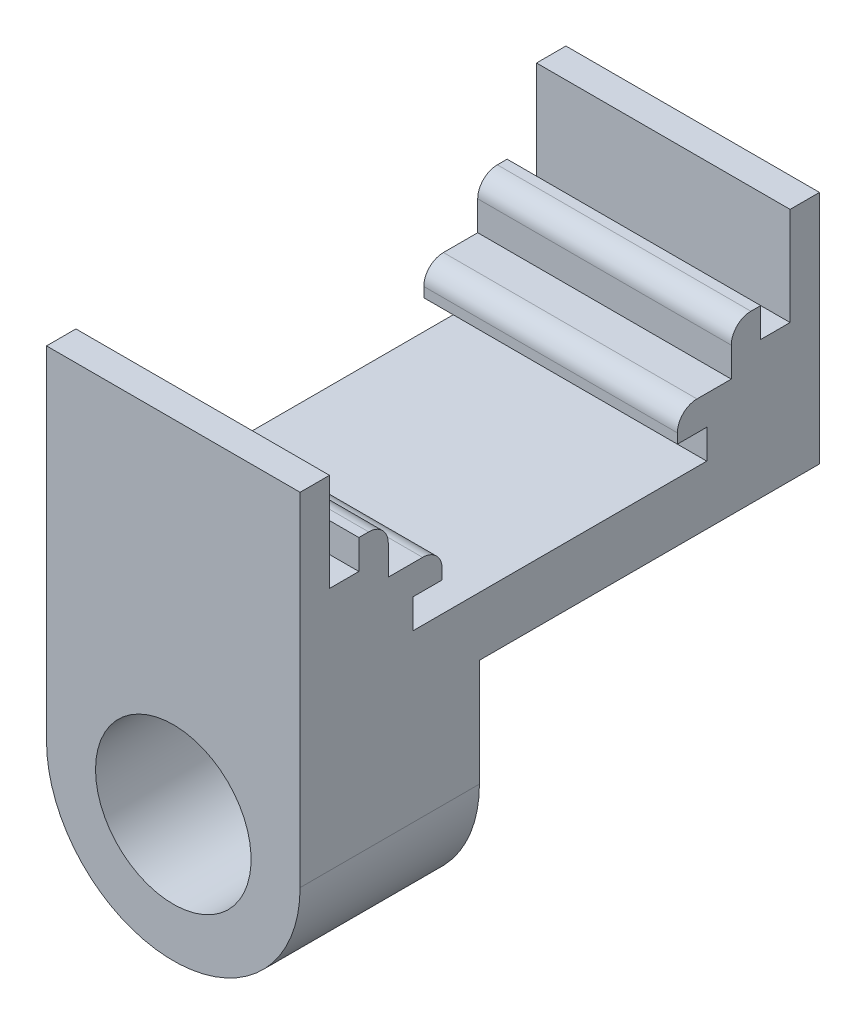
ISO-10303-21;
HEADER;
FILE_DESCRIPTION(('STEP AP214'),'2;1');
FILE_NAME('part.step','',(''),(''),'','','');
FILE_SCHEMA(('AUTOMOTIVE_DESIGN { 1 0 10303 214 1 1 1 1 }'));
ENDSEC;
DATA;
#1=APPLICATION_CONTEXT('core data for automotive mechanical design processes');
#2=APPLICATION_PROTOCOL_DEFINITION('international standard','automotive_design',2000,#1);
#3=PRODUCT_CONTEXT('',#1,'mechanical');
#4=PRODUCT('Part','Part','',(#3));
#5=PRODUCT_RELATED_PRODUCT_CATEGORY('part','',(#4));
#6=PRODUCT_DEFINITION_FORMATION('','',#4);
#7=PRODUCT_DEFINITION_CONTEXT('part definition',#1,'design');
#8=PRODUCT_DEFINITION('design','',#6,#7);
#9=PRODUCT_DEFINITION_SHAPE('','',#8);
#10=(LENGTH_UNIT() NAMED_UNIT(*) SI_UNIT(.MILLI.,.METRE.));
#11=(NAMED_UNIT(*) PLANE_ANGLE_UNIT() SI_UNIT($,.RADIAN.));
#12=(NAMED_UNIT(*) SI_UNIT($,.STERADIAN.) SOLID_ANGLE_UNIT());
#13=UNCERTAINTY_MEASURE_WITH_UNIT(LENGTH_MEASURE(1.E-05),#10,'distance_accuracy_value','');
#14=(GEOMETRIC_REPRESENTATION_CONTEXT(3) GLOBAL_UNCERTAINTY_ASSIGNED_CONTEXT((#13)) GLOBAL_UNIT_ASSIGNED_CONTEXT((#10,
#11,#12)) REPRESENTATION_CONTEXT('',''));
#15=CARTESIAN_POINT('',(0.,0.,0.));
#16=DIRECTION('',(0.,0.,1.));
#17=DIRECTION('',(1.,0.,0.));
#18=AXIS2_PLACEMENT_3D('',#15,#16,#17);
#19=CARTESIAN_POINT('',(25.875,-23.5,15.));
#20=DIRECTION('',(0.,-1.,0.));
#21=DIRECTION('',(0.,0.,-1.));
#22=AXIS2_PLACEMENT_3D('',#19,#20,#21);
#23=PLANE('',#22);
#24=DIRECTION('',(0.,0.,1.));
#25=VECTOR('',#24,1.);
#26=CARTESIAN_POINT('',(0.,-23.5,15.));
#27=LINE('',#26,#25);
#28=CARTESIAN_POINT('',(0.,-23.5,-15.));
#29=VERTEX_POINT('',#28);
#30=CARTESIAN_POINT('',(0.,-23.5,15.));
#31=VERTEX_POINT('',#30);
#32=EDGE_CURVE('E390',#29,#31,#27,.T.);
#33=ORIENTED_EDGE('',*,*,#32,.T.);
#34=DIRECTION('',(-1.,0.,0.));
#35=VECTOR('',#34,1.);
#36=CARTESIAN_POINT('',(25.875,-23.5,15.));
#37=LINE('',#36,#35);
#38=CARTESIAN_POINT('',(25.875,-23.5,15.));
#39=VERTEX_POINT('',#38);
#40=EDGE_CURVE('E465',#39,#31,#37,.T.);
#41=ORIENTED_EDGE('',*,*,#40,.F.);
#42=DIRECTION('',(0.,0.,1.));
#43=VECTOR('',#42,1.);
#44=CARTESIAN_POINT('',(25.875,-23.5,15.));
#45=LINE('',#44,#43);
#46=CARTESIAN_POINT('',(25.875,-23.5,-15.));
#47=VERTEX_POINT('',#46);
#48=EDGE_CURVE('E391',#47,#39,#45,.T.);
#49=ORIENTED_EDGE('',*,*,#48,.F.);
#50=DIRECTION('',(-1.,0.,0.));
#51=VECTOR('',#50,1.);
#52=CARTESIAN_POINT('',(25.875,-23.5,-15.));
#53=LINE('',#52,#51);
#54=EDGE_CURVE('E367',#47,#29,#53,.T.);
#55=ORIENTED_EDGE('',*,*,#54,.T.);
#56=EDGE_LOOP('',(#33,#41,#49,#55));
#57=FACE_BOUND('',#56,.T.);
#58=ADVANCED_FACE('F43',(#57),#23,.F.);
#59=CARTESIAN_POINT('',(25.875,-20.5,15.));
#60=DIRECTION('',(0.,0.,1.));
#61=DIRECTION('',(1.,0.,0.));
#62=AXIS2_PLACEMENT_3D('',#59,#60,#61);
#63=PLANE('',#62);
#64=DIRECTION('',(0.,1.,0.));
#65=VECTOR('',#64,1.);
#66=CARTESIAN_POINT('',(0.,-20.5,15.));
#67=LINE('',#66,#65);
#68=CARTESIAN_POINT('',(0.,-20.5,15.));
#69=VERTEX_POINT('',#68);
#70=EDGE_CURVE('E419',#31,#69,#67,.T.);
#71=ORIENTED_EDGE('',*,*,#70,.T.);
#72=DIRECTION('',(-1.,0.,0.));
#73=VECTOR('',#72,1.);
#74=CARTESIAN_POINT('',(25.875,-20.5,15.));
#75=LINE('',#74,#73);
#76=CARTESIAN_POINT('',(25.875,-20.5,15.));
#77=VERTEX_POINT('',#76);
#78=EDGE_CURVE('E462',#77,#69,#75,.T.);
#79=ORIENTED_EDGE('',*,*,#78,.F.);
#80=DIRECTION('',(0.,1.,0.));
#81=VECTOR('',#80,1.);
#82=CARTESIAN_POINT('',(25.875,-20.5,15.));
#83=LINE('',#82,#81);
#84=EDGE_CURVE('E393',#39,#77,#83,.T.);
#85=ORIENTED_EDGE('',*,*,#84,.F.);
#86=ORIENTED_EDGE('',*,*,#40,.T.);
#87=EDGE_LOOP('',(#71,#79,#85,#86));
#88=FACE_BOUND('',#87,.T.);
#89=ADVANCED_FACE('F571',(#88),#63,.F.);
#90=CARTESIAN_POINT('',(25.875,-20.5,12.));
#91=DIRECTION('',(0.,1.,0.));
#92=DIRECTION('',(0.,0.,1.));
#93=AXIS2_PLACEMENT_3D('',#90,#91,#92);
#94=PLANE('',#93);
#95=DIRECTION('',(0.,0.,-1.));
#96=VECTOR('',#95,1.);
#97=CARTESIAN_POINT('',(0.,-20.5,12.));
#98=LINE('',#97,#96);
#99=CARTESIAN_POINT('',(0.,-20.5,12.));
#100=VERTEX_POINT('',#99);
#101=EDGE_CURVE('E421',#69,#100,#98,.T.);
#102=ORIENTED_EDGE('',*,*,#101,.T.);
#103=DIRECTION('',(-1.,0.,0.));
#104=VECTOR('',#103,1.);
#105=CARTESIAN_POINT('',(25.875,-20.5,12.));
#106=LINE('',#105,#104);
#107=CARTESIAN_POINT('',(25.875,-20.5,12.));
#108=VERTEX_POINT('',#107);
#109=EDGE_CURVE('E459',#108,#100,#106,.T.);
#110=ORIENTED_EDGE('',*,*,#109,.F.);
#111=DIRECTION('',(0.,0.,-1.));
#112=VECTOR('',#111,1.);
#113=CARTESIAN_POINT('',(25.875,-20.5,12.));
#114=LINE('',#113,#112);
#115=EDGE_CURVE('E396',#77,#108,#114,.T.);
#116=ORIENTED_EDGE('',*,*,#115,.F.);
#117=ORIENTED_EDGE('',*,*,#78,.T.);
#118=EDGE_LOOP('',(#102,#110,#116,#117));
#119=FACE_BOUND('',#118,.T.);
#120=ADVANCED_FACE('F575',(#119),#94,.F.);
#121=CARTESIAN_POINT('',(25.875,-20.5,12.));
#122=DIRECTION('',(0.,0.,1.));
#123=DIRECTION('',(0.,-1.,0.));
#124=AXIS2_PLACEMENT_3D('',#121,#122,#123);
#125=PLANE('',#124);
#126=DIRECTION('',(0.,1.,0.));
#127=VECTOR('',#126,1.);
#128=CARTESIAN_POINT('',(0.,-20.5,12.));
#129=LINE('',#128,#127);
#130=CARTESIAN_POINT('',(0.,-19.5,12.));
#131=VERTEX_POINT('',#130);
#132=EDGE_CURVE('E423',#100,#131,#129,.T.);
#133=ORIENTED_EDGE('',*,*,#132,.T.);
#134=DIRECTION('',(-1.,0.,0.));
#135=VECTOR('',#134,1.);
#136=CARTESIAN_POINT('',(25.875,-19.5,12.));
#137=LINE('',#136,#135);
#138=CARTESIAN_POINT('',(25.875,-19.5,12.));
#139=VERTEX_POINT('',#138);
#140=EDGE_CURVE('E475',#131,#139,#137,.F.);
#141=ORIENTED_EDGE('',*,*,#140,.T.);
#142=DIRECTION('',(0.,1.,0.));
#143=VECTOR('',#142,1.);
#144=CARTESIAN_POINT('',(25.875,-20.5,12.));
#145=LINE('',#144,#143);
#146=EDGE_CURVE('E398',#108,#139,#145,.T.);
#147=ORIENTED_EDGE('',*,*,#146,.F.);
#148=ORIENTED_EDGE('',*,*,#109,.T.);
#149=EDGE_LOOP('',(#133,#141,#147,#148));
#150=FACE_BOUND('',#149,.T.);
#151=ADVANCED_FACE('F579',(#150),#125,.F.);
#152=CARTESIAN_POINT('',(25.875,-17.5,17.5));
#153=DIRECTION('',(0.,-1.,0.));
#154=DIRECTION('',(0.,0.,-1.));
#155=AXIS2_PLACEMENT_3D('',#152,#153,#154);
#156=PLANE('',#155);
#157=DIRECTION('',(0.,0.,1.));
#158=VECTOR('',#157,1.);
#159=CARTESIAN_POINT('',(25.875,-17.5,17.5));
#160=LINE('',#159,#158);
#161=CARTESIAN_POINT('',(25.875,-17.5,14.));
#162=VERTEX_POINT('',#161);
#163=CARTESIAN_POINT('',(25.875,-17.5,17.5));
#164=VERTEX_POINT('',#163);
#165=EDGE_CURVE('E401',#162,#164,#160,.T.);
#166=ORIENTED_EDGE('',*,*,#165,.F.);
#167=DIRECTION('',(-1.,0.,0.));
#168=VECTOR('',#167,1.);
#169=CARTESIAN_POINT('',(25.875,-17.5,14.));
#170=LINE('',#169,#168);
#171=CARTESIAN_POINT('',(0.,-17.5,14.));
#172=VERTEX_POINT('',#171);
#173=EDGE_CURVE('E468',#162,#172,#170,.T.);
#174=ORIENTED_EDGE('',*,*,#173,.T.);
#175=DIRECTION('',(0.,0.,1.));
#176=VECTOR('',#175,1.);
#177=CARTESIAN_POINT('',(0.,-17.5,17.5));
#178=LINE('',#177,#176);
#179=CARTESIAN_POINT('',(0.,-17.5,17.5));
#180=VERTEX_POINT('',#179);
#181=EDGE_CURVE('E426',#172,#180,#178,.T.);
#182=ORIENTED_EDGE('',*,*,#181,.T.);
#183=DIRECTION('',(-1.,0.,0.));
#184=VECTOR('',#183,1.);
#185=CARTESIAN_POINT('',(25.875,-17.5,17.5));
#186=LINE('',#185,#184);
#187=EDGE_CURVE('E456',#164,#180,#186,.T.);
#188=ORIENTED_EDGE('',*,*,#187,.F.);
#189=EDGE_LOOP('',(#166,#174,#182,#188));
#190=FACE_BOUND('',#189,.T.);
#191=ADVANCED_FACE('F588',(#190),#156,.F.);
#192=CARTESIAN_POINT('',(25.875,-12.5,17.5));
#193=DIRECTION('',(0.,0.,1.));
#194=DIRECTION('',(1.,0.,0.));
#195=AXIS2_PLACEMENT_3D('',#192,#193,#194);
#196=PLANE('',#195);
#197=DIRECTION('',(0.,1.,0.));
#198=VECTOR('',#197,1.);
#199=CARTESIAN_POINT('',(0.,-12.5,17.5));
#200=LINE('',#199,#198);
#201=CARTESIAN_POINT('',(0.,-14.5,17.5));
#202=VERTEX_POINT('',#201);
#203=EDGE_CURVE('E428',#180,#202,#200,.T.);
#204=ORIENTED_EDGE('',*,*,#203,.T.);
#205=DIRECTION('',(-1.,0.,0.));
#206=VECTOR('',#205,1.);
#207=CARTESIAN_POINT('',(25.875,-14.5,17.5));
#208=LINE('',#207,#206);
#209=CARTESIAN_POINT('',(25.875,-14.5,17.5));
#210=VERTEX_POINT('',#209);
#211=EDGE_CURVE('E12',#202,#210,#208,.F.);
#212=ORIENTED_EDGE('',*,*,#211,.T.);
#213=DIRECTION('',(0.,1.,0.));
#214=VECTOR('',#213,1.);
#215=CARTESIAN_POINT('',(25.875,-12.5,17.5));
#216=LINE('',#215,#214);
#217=EDGE_CURVE('E403',#164,#210,#216,.T.);
#218=ORIENTED_EDGE('',*,*,#217,.F.);
#219=ORIENTED_EDGE('',*,*,#187,.T.);
#220=EDGE_LOOP('',(#204,#212,#218,#219));
#221=FACE_BOUND('',#220,.T.);
#222=ADVANCED_FACE('F592',(#221),#196,.F.);
#223=CARTESIAN_POINT('',(25.875,-12.5,20.5));
#224=DIRECTION('',(0.,-1.,0.));
#225=DIRECTION('',(0.,0.,-1.));
#226=AXIS2_PLACEMENT_3D('',#223,#224,#225);
#227=PLANE('',#226);
#228=DIRECTION('',(0.,0.,1.));
#229=VECTOR('',#228,1.);
#230=CARTESIAN_POINT('',(25.875,-12.5,20.5));
#231=LINE('',#230,#229);
#232=CARTESIAN_POINT('',(25.875,-12.5,19.5));
#233=VERTEX_POINT('',#232);
#234=CARTESIAN_POINT('',(25.875,-12.5,20.5));
#235=VERTEX_POINT('',#234);
#236=EDGE_CURVE('E405',#233,#235,#231,.T.);
#237=ORIENTED_EDGE('',*,*,#236,.F.);
#238=DIRECTION('',(-1.,0.,0.));
#239=VECTOR('',#238,1.);
#240=CARTESIAN_POINT('',(25.875,-12.5,19.5));
#241=LINE('',#240,#239);
#242=CARTESIAN_POINT('',(0.,-12.5,19.5));
#243=VERTEX_POINT('',#242);
#244=EDGE_CURVE('E51',#233,#243,#241,.T.);
#245=ORIENTED_EDGE('',*,*,#244,.T.);
#246=DIRECTION('',(0.,0.,1.));
#247=VECTOR('',#246,1.);
#248=CARTESIAN_POINT('',(0.,-12.5,20.5));
#249=LINE('',#248,#247);
#250=CARTESIAN_POINT('',(0.,-12.5,20.5));
#251=VERTEX_POINT('',#250);
#252=EDGE_CURVE('E431',#243,#251,#249,.T.);
#253=ORIENTED_EDGE('',*,*,#252,.T.);
#254=DIRECTION('',(-1.,0.,0.));
#255=VECTOR('',#254,1.);
#256=CARTESIAN_POINT('',(25.875,-12.5,20.5));
#257=LINE('',#256,#255);
#258=EDGE_CURVE('E453',#235,#251,#257,.T.);
#259=ORIENTED_EDGE('',*,*,#258,.F.);
#260=EDGE_LOOP('',(#237,#245,#253,#259));
#261=FACE_BOUND('',#260,.T.);
#262=ADVANCED_FACE('F483',(#261),#227,.F.);
#263=CARTESIAN_POINT('',(25.875,-15.5,20.5));
#264=DIRECTION('',(0.,0.,-1.));
#265=DIRECTION('',(-1.,0.,0.));
#266=AXIS2_PLACEMENT_3D('',#263,#264,#265);
#267=PLANE('',#266);
#268=DIRECTION('',(0.,-1.,0.));
#269=VECTOR('',#268,1.);
#270=CARTESIAN_POINT('',(0.,-15.5,20.5));
#271=LINE('',#270,#269);
#272=CARTESIAN_POINT('',(0.,-15.5,20.5));
#273=VERTEX_POINT('',#272);
#274=EDGE_CURVE('E433',#251,#273,#271,.T.);
#275=ORIENTED_EDGE('',*,*,#274,.T.);
#276=DIRECTION('',(-1.,0.,0.));
#277=VECTOR('',#276,1.);
#278=CARTESIAN_POINT('',(25.875,-15.5,20.5));
#279=LINE('',#278,#277);
#280=CARTESIAN_POINT('',(25.875,-15.5,20.5));
#281=VERTEX_POINT('',#280);
#282=EDGE_CURVE('E450',#281,#273,#279,.T.);
#283=ORIENTED_EDGE('',*,*,#282,.F.);
#284=DIRECTION('',(0.,-1.,0.));
#285=VECTOR('',#284,1.);
#286=CARTESIAN_POINT('',(25.875,-15.5,20.5));
#287=LINE('',#286,#285);
#288=EDGE_CURVE('E407',#235,#281,#287,.T.);
#289=ORIENTED_EDGE('',*,*,#288,.F.);
#290=ORIENTED_EDGE('',*,*,#258,.T.);
#291=EDGE_LOOP('',(#275,#283,#289,#290));
#292=FACE_BOUND('',#291,.T.);
#293=ADVANCED_FACE('F494',(#292),#267,.F.);
#294=CARTESIAN_POINT('',(25.875,-15.5,23.5));
#295=DIRECTION('',(0.,-1.,0.));
#296=DIRECTION('',(0.,0.,-1.));
#297=AXIS2_PLACEMENT_3D('',#294,#295,#296);
#298=PLANE('',#297);
#299=DIRECTION('',(0.,0.,1.));
#300=VECTOR('',#299,1.);
#301=CARTESIAN_POINT('',(0.,-15.5,23.5));
#302=LINE('',#301,#300);
#303=CARTESIAN_POINT('',(0.,-15.5,23.5));
#304=VERTEX_POINT('',#303);
#305=EDGE_CURVE('E435',#273,#304,#302,.T.);
#306=ORIENTED_EDGE('',*,*,#305,.T.);
#307=DIRECTION('',(-1.,0.,0.));
#308=VECTOR('',#307,1.);
#309=CARTESIAN_POINT('',(25.875,-15.5,23.5));
#310=LINE('',#309,#308);
#311=CARTESIAN_POINT('',(25.875,-15.5,23.5));
#312=VERTEX_POINT('',#311);
#313=EDGE_CURVE('E447',#312,#304,#310,.T.);
#314=ORIENTED_EDGE('',*,*,#313,.F.);
#315=DIRECTION('',(0.,0.,1.));
#316=VECTOR('',#315,1.);
#317=CARTESIAN_POINT('',(25.875,-15.5,23.5));
#318=LINE('',#317,#316);
#319=EDGE_CURVE('E409',#281,#312,#318,.T.);
#320=ORIENTED_EDGE('',*,*,#319,.F.);
#321=ORIENTED_EDGE('',*,*,#282,.T.);
#322=EDGE_LOOP('',(#306,#314,#320,#321));
#323=FACE_BOUND('',#322,.T.);
#324=ADVANCED_FACE('F498',(#323),#298,.F.);
#325=CARTESIAN_POINT('',(25.875,-5.50000000000001,23.5));
#326=DIRECTION('',(0.,0.,1.));
#327=DIRECTION('',(0.,-1.,0.));
#328=AXIS2_PLACEMENT_3D('',#325,#326,#327);
#329=PLANE('',#328);
#330=DIRECTION('',(0.,1.,0.));
#331=VECTOR('',#330,1.);
#332=CARTESIAN_POINT('',(0.,-5.50000000000001,23.5));
#333=LINE('',#332,#331);
#334=CARTESIAN_POINT('',(0.,-5.50000000000001,23.5));
#335=VERTEX_POINT('',#334);
#336=EDGE_CURVE('E437',#304,#335,#333,.T.);
#337=ORIENTED_EDGE('',*,*,#336,.T.);
#338=DIRECTION('',(-1.,0.,0.));
#339=VECTOR('',#338,1.);
#340=CARTESIAN_POINT('',(25.875,-5.50000000000001,23.5));
#341=LINE('',#340,#339);
#342=CARTESIAN_POINT('',(25.875,-5.50000000000001,23.5));
#343=VERTEX_POINT('',#342);
#344=EDGE_CURVE('E444',#343,#335,#341,.T.);
#345=ORIENTED_EDGE('',*,*,#344,.F.);
#346=DIRECTION('',(0.,1.,0.));
#347=VECTOR('',#346,1.);
#348=CARTESIAN_POINT('',(25.875,-5.50000000000001,23.5));
#349=LINE('',#348,#347);
#350=EDGE_CURVE('E411',#312,#343,#349,.T.);
#351=ORIENTED_EDGE('',*,*,#350,.F.);
#352=ORIENTED_EDGE('',*,*,#313,.T.);
#353=EDGE_LOOP('',(#337,#345,#351,#352));
#354=FACE_BOUND('',#353,.T.);
#355=ADVANCED_FACE('F505',(#354),#329,.F.);
#356=CARTESIAN_POINT('',(25.875,-5.50000000000001,23.5));
#357=DIRECTION('',(0.,-1.,0.));
#358=DIRECTION('',(0.,0.,-1.));
#359=AXIS2_PLACEMENT_3D('',#356,#357,#358);
#360=PLANE('',#359);
#361=DIRECTION('',(0.,0.,1.));
#362=VECTOR('',#361,1.);
#363=CARTESIAN_POINT('',(0.,-5.50000000000001,23.5));
#364=LINE('',#363,#362);
#365=CARTESIAN_POINT('',(0.,-5.50000000000001,26.5));
#366=VERTEX_POINT('',#365);
#367=EDGE_CURVE('E439',#335,#366,#364,.T.);
#368=ORIENTED_EDGE('',*,*,#367,.T.);
#369=DIRECTION('',(-1.,0.,0.));
#370=VECTOR('',#369,1.);
#371=CARTESIAN_POINT('',(25.875,-5.50000000000001,26.5));
#372=LINE('',#371,#370);
#373=CARTESIAN_POINT('',(25.875,-5.50000000000001,26.5));
#374=VERTEX_POINT('',#373);
#375=EDGE_CURVE('E417',#374,#366,#372,.T.);
#376=ORIENTED_EDGE('',*,*,#375,.F.);
#377=DIRECTION('',(0.,0.,1.));
#378=VECTOR('',#377,1.);
#379=CARTESIAN_POINT('',(25.875,-5.50000000000001,23.5));
#380=LINE('',#379,#378);
#381=EDGE_CURVE('E413',#343,#374,#380,.T.);
#382=ORIENTED_EDGE('',*,*,#381,.F.);
#383=ORIENTED_EDGE('',*,*,#344,.T.);
#384=EDGE_LOOP('',(#368,#376,#382,#383));
#385=FACE_BOUND('',#384,.T.);
#386=ADVANCED_FACE('F508',(#385),#360,.F.);
#387=CARTESIAN_POINT('',(25.875,-27.5,26.5));
#388=DIRECTION('',(0.,0.,-1.));
#389=DIRECTION('',(-1.,0.,0.));
#390=AXIS2_PLACEMENT_3D('',#387,#388,#389);
#391=PLANE('',#390);
#392=CARTESIAN_POINT('',(12.9375,-40.4375,26.5));
#393=DIRECTION('',(0.,0.,-1.));
#394=DIRECTION('',(-1.,0.,0.));
#395=AXIS2_PLACEMENT_3D('',#392,#393,#394);
#396=CIRCLE('',#395,12.9375);
#397=CARTESIAN_POINT('',(25.875,-40.4375,26.5));
#398=VERTEX_POINT('',#397);
#399=CARTESIAN_POINT('',(0.,-40.4375,26.5));
#400=VERTEX_POINT('',#399);
#401=EDGE_CURVE('E269',#398,#400,#396,.T.);
#402=ORIENTED_EDGE('',*,*,#401,.F.);
#403=DIRECTION('',(0.,-1.,0.));
#404=VECTOR('',#403,1.);
#405=CARTESIAN_POINT('',(25.875,-27.5,26.5));
#406=LINE('',#405,#404);
#407=EDGE_CURVE('E415',#374,#398,#406,.T.);
#408=ORIENTED_EDGE('',*,*,#407,.F.);
#409=ORIENTED_EDGE('',*,*,#375,.T.);
#410=DIRECTION('',(0.,-1.,0.));
#411=VECTOR('',#410,1.);
#412=CARTESIAN_POINT('',(0.,-27.5,26.5));
#413=LINE('',#412,#411);
#414=EDGE_CURVE('E394',#366,#400,#413,.T.);
#415=ORIENTED_EDGE('',*,*,#414,.T.);
#416=EDGE_LOOP('',(#402,#408,#409,#415));
#417=FACE_BOUND('',#416,.T.);
#418=CARTESIAN_POINT('',(12.9375,-40.4375,26.5));
#419=DIRECTION('',(0.,0.,-1.));
#420=DIRECTION('',(-1.,0.,0.));
#421=AXIS2_PLACEMENT_3D('',#418,#419,#420);
#422=CIRCLE('',#421,7.9375);
#423=CARTESIAN_POINT('',(5.,-40.4375,26.5));
#424=VERTEX_POINT('',#423);
#425=EDGE_CURVE('E265',#424,#424,#422,.T.);
#426=ORIENTED_EDGE('',*,*,#425,.T.);
#427=EDGE_LOOP('',(#426));
#428=FACE_BOUND('',#427,.T.);
#429=ADVANCED_FACE('F513',(#417,#428),#391,.F.);
#430=CARTESIAN_POINT('',(25.875,0.,0.));
#431=DIRECTION('',(-1.,0.,0.));
#432=DIRECTION('',(0.,0.,1.));
#433=AXIS2_PLACEMENT_3D('',#430,#431,#432);
#434=PLANE('',#433);
#435=DIRECTION('',(0.,0.,1.));
#436=VECTOR('',#435,1.);
#437=CARTESIAN_POINT('',(25.875,-29.5,-26.5));
#438=LINE('',#437,#436);
#439=CARTESIAN_POINT('',(25.875,-29.5,-26.5));
#440=VERTEX_POINT('',#439);
#441=CARTESIAN_POINT('',(25.875,-29.5,8.2));
#442=VERTEX_POINT('',#441);
#443=EDGE_CURVE('E251',#440,#442,#438,.T.);
#444=ORIENTED_EDGE('',*,*,#443,.F.);
#445=DIRECTION('',(0.,-1.,0.));
#446=VECTOR('',#445,1.);
#447=CARTESIAN_POINT('',(25.875,-27.5,-26.5));
#448=LINE('',#447,#446);
#449=CARTESIAN_POINT('',(25.875,-5.5,-26.5));
#450=VERTEX_POINT('',#449);
#451=EDGE_CURVE('E240',#450,#440,#448,.T.);
#452=ORIENTED_EDGE('',*,*,#451,.F.);
#453=DIRECTION('',(0.,0.,-1.));
#454=VECTOR('',#453,1.);
#455=CARTESIAN_POINT('',(25.875,-5.5,-23.5));
#456=LINE('',#455,#454);
#457=CARTESIAN_POINT('',(25.875,-5.5,-23.5));
#458=VERTEX_POINT('',#457);
#459=EDGE_CURVE('E248',#458,#450,#456,.T.);
#460=ORIENTED_EDGE('',*,*,#459,.F.);
#461=DIRECTION('',(0.,1.,0.));
#462=VECTOR('',#461,1.);
#463=CARTESIAN_POINT('',(25.875,-5.5,-23.5));
#464=LINE('',#463,#462);
#465=CARTESIAN_POINT('',(25.875,-15.5,-23.5));
#466=VERTEX_POINT('',#465);
#467=EDGE_CURVE('E311',#466,#458,#464,.T.);
#468=ORIENTED_EDGE('',*,*,#467,.F.);
#469=DIRECTION('',(0.,0.,-1.));
#470=VECTOR('',#469,1.);
#471=CARTESIAN_POINT('',(25.875,-15.5,-23.5));
#472=LINE('',#471,#470);
#473=CARTESIAN_POINT('',(25.875,-15.5,-20.5));
#474=VERTEX_POINT('',#473);
#475=EDGE_CURVE('E308',#474,#466,#472,.T.);
#476=ORIENTED_EDGE('',*,*,#475,.F.);
#477=DIRECTION('',(0.,-1.,0.));
#478=VECTOR('',#477,1.);
#479=CARTESIAN_POINT('',(25.875,-15.5,-20.5));
#480=LINE('',#479,#478);
#481=CARTESIAN_POINT('',(25.875,-12.5,-20.5));
#482=VERTEX_POINT('',#481);
#483=EDGE_CURVE('E305',#482,#474,#480,.T.);
#484=ORIENTED_EDGE('',*,*,#483,.F.);
#485=DIRECTION('',(0.,0.,-1.));
#486=VECTOR('',#485,1.);
#487=CARTESIAN_POINT('',(25.875,-12.5,-20.5));
#488=LINE('',#487,#486);
#489=CARTESIAN_POINT('',(25.875,-12.5,-19.5));
#490=VERTEX_POINT('',#489);
#491=EDGE_CURVE('E302',#490,#482,#488,.T.);
#492=ORIENTED_EDGE('',*,*,#491,.F.);
#493=CARTESIAN_POINT('',(25.875,-14.5,-19.5));
#494=DIRECTION('',(1.,0.,0.));
#495=DIRECTION('',(0.,0.,-1.));
#496=AXIS2_PLACEMENT_3D('',#493,#494,#495);
#497=CIRCLE('',#496,2.);
#498=CARTESIAN_POINT('',(25.875,-14.5,-17.5));
#499=VERTEX_POINT('',#498);
#500=EDGE_CURVE('E380',#499,#490,#497,.F.);
#501=ORIENTED_EDGE('',*,*,#500,.F.);
#502=DIRECTION('',(0.,1.,0.));
#503=VECTOR('',#502,1.);
#504=CARTESIAN_POINT('',(25.875,-12.5,-17.5));
#505=LINE('',#504,#503);
#506=CARTESIAN_POINT('',(25.875,-17.5,-17.5));
#507=VERTEX_POINT('',#506);
#508=EDGE_CURVE('E299',#507,#499,#505,.T.);
#509=ORIENTED_EDGE('',*,*,#508,.F.);
#510=DIRECTION('',(0.,0.,-1.));
#511=VECTOR('',#510,1.);
#512=CARTESIAN_POINT('',(25.875,-17.5,-17.5));
#513=LINE('',#512,#511);
#514=CARTESIAN_POINT('',(25.875,-17.5,-14.));
#515=VERTEX_POINT('',#514);
#516=EDGE_CURVE('E296',#515,#507,#513,.T.);
#517=ORIENTED_EDGE('',*,*,#516,.F.);
#518=CARTESIAN_POINT('',(25.875,-19.5,-14.));
#519=DIRECTION('',(1.,0.,0.));
#520=DIRECTION('',(0.,0.,-1.));
#521=AXIS2_PLACEMENT_3D('',#518,#519,#520);
#522=CIRCLE('',#521,2.);
#523=CARTESIAN_POINT('',(25.875,-19.5,-12.));
#524=VERTEX_POINT('',#523);
#525=EDGE_CURVE('E382',#524,#515,#522,.F.);
#526=ORIENTED_EDGE('',*,*,#525,.F.);
#527=DIRECTION('',(0.,1.,0.));
#528=VECTOR('',#527,1.);
#529=CARTESIAN_POINT('',(25.875,-20.5,-12.));
#530=LINE('',#529,#528);
#531=CARTESIAN_POINT('',(25.875,-20.5,-12.));
#532=VERTEX_POINT('',#531);
#533=EDGE_CURVE('E293',#532,#524,#530,.T.);
#534=ORIENTED_EDGE('',*,*,#533,.F.);
#535=DIRECTION('',(0.,0.,1.));
#536=VECTOR('',#535,1.);
#537=CARTESIAN_POINT('',(25.875,-20.5,-12.));
#538=LINE('',#537,#536);
#539=CARTESIAN_POINT('',(25.875,-20.5,-15.));
#540=VERTEX_POINT('',#539);
#541=EDGE_CURVE('E289',#540,#532,#538,.T.);
#542=ORIENTED_EDGE('',*,*,#541,.F.);
#543=DIRECTION('',(0.,1.,0.));
#544=VECTOR('',#543,1.);
#545=CARTESIAN_POINT('',(25.875,-20.5,-15.));
#546=LINE('',#545,#544);
#547=EDGE_CURVE('E286',#47,#540,#546,.T.);
#548=ORIENTED_EDGE('',*,*,#547,.F.);
#549=ORIENTED_EDGE('',*,*,#48,.T.);
#550=ORIENTED_EDGE('',*,*,#84,.T.);
#551=ORIENTED_EDGE('',*,*,#115,.T.);
#552=ORIENTED_EDGE('',*,*,#146,.T.);
#553=CARTESIAN_POINT('',(25.875,-19.5,14.));
#554=DIRECTION('',(-1.,0.,0.));
#555=DIRECTION('',(0.,0.,1.));
#556=AXIS2_PLACEMENT_3D('',#553,#554,#555);
#557=CIRCLE('',#556,2.);
#558=EDGE_CURVE('E478',#139,#162,#557,.F.);
#559=ORIENTED_EDGE('',*,*,#558,.T.);
#560=ORIENTED_EDGE('',*,*,#165,.T.);
#561=ORIENTED_EDGE('',*,*,#217,.T.);
#562=CARTESIAN_POINT('',(25.875,-14.5,19.5));
#563=DIRECTION('',(-1.,0.,0.));
#564=DIRECTION('',(0.,0.,1.));
#565=AXIS2_PLACEMENT_3D('',#562,#563,#564);
#566=CIRCLE('',#565,2.);
#567=EDGE_CURVE('E66',#210,#233,#566,.F.);
#568=ORIENTED_EDGE('',*,*,#567,.T.);
#569=ORIENTED_EDGE('',*,*,#236,.T.);
#570=ORIENTED_EDGE('',*,*,#288,.T.);
#571=ORIENTED_EDGE('',*,*,#319,.T.);
#572=ORIENTED_EDGE('',*,*,#350,.T.);
#573=ORIENTED_EDGE('',*,*,#381,.T.);
#574=ORIENTED_EDGE('',*,*,#407,.T.);
#575=DIRECTION('',(0.,0.,1.));
#576=VECTOR('',#575,1.);
#577=CARTESIAN_POINT('',(25.875,-40.4375,8.2));
#578=LINE('',#577,#576);
#579=CARTESIAN_POINT('',(25.875,-40.4375,8.2));
#580=VERTEX_POINT('',#579);
#581=EDGE_CURVE('E282',#580,#398,#578,.T.);
#582=ORIENTED_EDGE('',*,*,#581,.F.);
#583=DIRECTION('',(0.,-1.,0.));
#584=VECTOR('',#583,1.);
#585=CARTESIAN_POINT('',(25.875,-27.5,8.2));
#586=LINE('',#585,#584);
#587=EDGE_CURVE('E254',#442,#580,#586,.T.);
#588=ORIENTED_EDGE('',*,*,#587,.F.);
#589=EDGE_LOOP('',(#444,#452,#460,#468,#476,#484,#492,#501,#509,#517,#526,#534,#542,#548,#549,
#550,#551,#552,#559,#560,#561,#568,#569,#570,#571,#572,#573,#574,#582,#588));
#590=FACE_BOUND('',#589,.T.);
#591=ADVANCED_FACE('F252',(#590),#434,.F.);
#592=CARTESIAN_POINT('',(0.,0.,0.));
#593=DIRECTION('',(-1.,0.,0.));
#594=DIRECTION('',(0.,0.,1.));
#595=AXIS2_PLACEMENT_3D('',#592,#593,#594);
#596=PLANE('',#595);
#597=DIRECTION('',(0.,-1.,0.));
#598=VECTOR('',#597,1.);
#599=CARTESIAN_POINT('',(0.,-27.5,-26.5));
#600=LINE('',#599,#598);
#601=CARTESIAN_POINT('',(0.,-5.5,-26.5));
#602=VERTEX_POINT('',#601);
#603=CARTESIAN_POINT('',(0.,-29.5,-26.5));
#604=VERTEX_POINT('',#603);
#605=EDGE_CURVE('E290',#602,#604,#600,.T.);
#606=ORIENTED_EDGE('',*,*,#605,.T.);
#607=DIRECTION('',(0.,0.,-1.));
#608=VECTOR('',#607,1.);
#609=CARTESIAN_POINT('',(0.,-29.5,8.2));
#610=LINE('',#609,#608);
#611=CARTESIAN_POINT('',(0.,-29.5,8.2));
#612=VERTEX_POINT('',#611);
#613=EDGE_CURVE('E260',#612,#604,#610,.T.);
#614=ORIENTED_EDGE('',*,*,#613,.F.);
#615=DIRECTION('',(0.,1.,0.));
#616=VECTOR('',#615,1.);
#617=CARTESIAN_POINT('',(0.,-27.5,8.2));
#618=LINE('',#617,#616);
#619=CARTESIAN_POINT('',(0.,-40.4375,8.2));
#620=VERTEX_POINT('',#619);
#621=EDGE_CURVE('E275',#620,#612,#618,.T.);
#622=ORIENTED_EDGE('',*,*,#621,.F.);
#623=DIRECTION('',(0.,0.,1.));
#624=VECTOR('',#623,1.);
#625=CARTESIAN_POINT('',(0.,-40.4375,8.2));
#626=LINE('',#625,#624);
#627=EDGE_CURVE('E277',#620,#400,#626,.T.);
#628=ORIENTED_EDGE('',*,*,#627,.T.);
#629=ORIENTED_EDGE('',*,*,#414,.F.);
#630=ORIENTED_EDGE('',*,*,#367,.F.);
#631=ORIENTED_EDGE('',*,*,#336,.F.);
#632=ORIENTED_EDGE('',*,*,#305,.F.);
#633=ORIENTED_EDGE('',*,*,#274,.F.);
#634=ORIENTED_EDGE('',*,*,#252,.F.);
#635=CARTESIAN_POINT('',(0.,-14.5,19.5));
#636=DIRECTION('',(-1.,0.,0.));
#637=DIRECTION('',(0.,0.,1.));
#638=AXIS2_PLACEMENT_3D('',#635,#636,#637);
#639=CIRCLE('',#638,2.);
#640=EDGE_CURVE('E471',#243,#202,#639,.T.);
#641=ORIENTED_EDGE('',*,*,#640,.T.);
#642=ORIENTED_EDGE('',*,*,#203,.F.);
#643=ORIENTED_EDGE('',*,*,#181,.F.);
#644=CARTESIAN_POINT('',(0.,-19.5,14.));
#645=DIRECTION('',(-1.,0.,0.));
#646=DIRECTION('',(0.,0.,1.));
#647=AXIS2_PLACEMENT_3D('',#644,#645,#646);
#648=CIRCLE('',#647,2.);
#649=EDGE_CURVE('E473',#172,#131,#648,.T.);
#650=ORIENTED_EDGE('',*,*,#649,.T.);
#651=ORIENTED_EDGE('',*,*,#132,.F.);
#652=ORIENTED_EDGE('',*,*,#101,.F.);
#653=ORIENTED_EDGE('',*,*,#70,.F.);
#654=ORIENTED_EDGE('',*,*,#32,.F.);
#655=DIRECTION('',(0.,1.,0.));
#656=VECTOR('',#655,1.);
#657=CARTESIAN_POINT('',(0.,-20.5,-15.));
#658=LINE('',#657,#656);
#659=CARTESIAN_POINT('',(0.,-20.5,-15.));
#660=VERTEX_POINT('',#659);
#661=EDGE_CURVE('E285',#29,#660,#658,.T.);
#662=ORIENTED_EDGE('',*,*,#661,.T.);
#663=DIRECTION('',(0.,0.,1.));
#664=VECTOR('',#663,1.);
#665=CARTESIAN_POINT('',(0.,-20.5,-12.));
#666=LINE('',#665,#664);
#667=CARTESIAN_POINT('',(0.,-20.5,-12.));
#668=VERTEX_POINT('',#667);
#669=EDGE_CURVE('E317',#660,#668,#666,.T.);
#670=ORIENTED_EDGE('',*,*,#669,.T.);
#671=DIRECTION('',(0.,1.,0.));
#672=VECTOR('',#671,1.);
#673=CARTESIAN_POINT('',(0.,-20.5,-12.));
#674=LINE('',#673,#672);
#675=CARTESIAN_POINT('',(0.,-19.5,-12.));
#676=VERTEX_POINT('',#675);
#677=EDGE_CURVE('E320',#668,#676,#674,.T.);
#678=ORIENTED_EDGE('',*,*,#677,.T.);
#679=CARTESIAN_POINT('',(0.,-19.5,-14.));
#680=DIRECTION('',(1.,0.,0.));
#681=DIRECTION('',(0.,0.,-1.));
#682=AXIS2_PLACEMENT_3D('',#679,#680,#681);
#683=CIRCLE('',#682,2.);
#684=CARTESIAN_POINT('',(0.,-17.5,-14.));
#685=VERTEX_POINT('',#684);
#686=EDGE_CURVE('E375',#685,#676,#683,.T.);
#687=ORIENTED_EDGE('',*,*,#686,.F.);
#688=DIRECTION('',(0.,0.,-1.));
#689=VECTOR('',#688,1.);
#690=CARTESIAN_POINT('',(0.,-17.5,-17.5));
#691=LINE('',#690,#689);
#692=CARTESIAN_POINT('',(0.,-17.5,-17.5));
#693=VERTEX_POINT('',#692);
#694=EDGE_CURVE('E323',#685,#693,#691,.T.);
#695=ORIENTED_EDGE('',*,*,#694,.T.);
#696=DIRECTION('',(0.,1.,0.));
#697=VECTOR('',#696,1.);
#698=CARTESIAN_POINT('',(0.,-12.5,-17.5));
#699=LINE('',#698,#697);
#700=CARTESIAN_POINT('',(0.,-14.5,-17.5));
#701=VERTEX_POINT('',#700);
#702=EDGE_CURVE('E326',#693,#701,#699,.T.);
#703=ORIENTED_EDGE('',*,*,#702,.T.);
#704=CARTESIAN_POINT('',(0.,-14.5,-19.5));
#705=DIRECTION('',(1.,0.,0.));
#706=DIRECTION('',(0.,0.,-1.));
#707=AXIS2_PLACEMENT_3D('',#704,#705,#706);
#708=CIRCLE('',#707,2.);
#709=CARTESIAN_POINT('',(0.,-12.5,-19.5));
#710=VERTEX_POINT('',#709);
#711=EDGE_CURVE('E373',#710,#701,#708,.T.);
#712=ORIENTED_EDGE('',*,*,#711,.F.);
#713=DIRECTION('',(0.,0.,-1.));
#714=VECTOR('',#713,1.);
#715=CARTESIAN_POINT('',(0.,-12.5,-20.5));
#716=LINE('',#715,#714);
#717=CARTESIAN_POINT('',(0.,-12.5,-20.5));
#718=VERTEX_POINT('',#717);
#719=EDGE_CURVE('E329',#710,#718,#716,.T.);
#720=ORIENTED_EDGE('',*,*,#719,.T.);
#721=DIRECTION('',(0.,-1.,0.));
#722=VECTOR('',#721,1.);
#723=CARTESIAN_POINT('',(0.,-15.5,-20.5));
#724=LINE('',#723,#722);
#725=CARTESIAN_POINT('',(0.,-15.5,-20.5));
#726=VERTEX_POINT('',#725);
#727=EDGE_CURVE('E332',#718,#726,#724,.T.);
#728=ORIENTED_EDGE('',*,*,#727,.T.);
#729=DIRECTION('',(0.,0.,-1.));
#730=VECTOR('',#729,1.);
#731=CARTESIAN_POINT('',(0.,-15.5,-23.5));
#732=LINE('',#731,#730);
#733=CARTESIAN_POINT('',(0.,-15.5,-23.5));
#734=VERTEX_POINT('',#733);
#735=EDGE_CURVE('E335',#726,#734,#732,.T.);
#736=ORIENTED_EDGE('',*,*,#735,.T.);
#737=DIRECTION('',(0.,1.,0.));
#738=VECTOR('',#737,1.);
#739=CARTESIAN_POINT('',(0.,-5.5,-23.5));
#740=LINE('',#739,#738);
#741=CARTESIAN_POINT('',(0.,-5.5,-23.5));
#742=VERTEX_POINT('',#741);
#743=EDGE_CURVE('E338',#734,#742,#740,.T.);
#744=ORIENTED_EDGE('',*,*,#743,.T.);
#745=DIRECTION('',(0.,0.,-1.));
#746=VECTOR('',#745,1.);
#747=CARTESIAN_POINT('',(0.,-5.5,-23.5));
#748=LINE('',#747,#746);
#749=EDGE_CURVE('E341',#742,#602,#748,.T.);
#750=ORIENTED_EDGE('',*,*,#749,.T.);
#751=EDGE_LOOP('',(#606,#614,#622,#628,#629,#630,#631,#632,#633,#634,#641,#642,#643,#650,#651,
#652,#653,#654,#662,#670,#678,#687,#695,#703,#712,#720,#728,#736,#744,#750));
#752=FACE_BOUND('',#751,.T.);
#753=ADVANCED_FACE('F488',(#752),#596,.T.);
#754=CARTESIAN_POINT('',(25.875,-19.5,14.));
#755=DIRECTION('',(-1.,0.,0.));
#756=DIRECTION('',(0.,0.,1.));
#757=AXIS2_PLACEMENT_3D('',#754,#755,#756);
#758=CYLINDRICAL_SURFACE('',#757,2.);
#759=ORIENTED_EDGE('',*,*,#558,.F.);
#760=ORIENTED_EDGE('',*,*,#140,.F.);
#761=ORIENTED_EDGE('',*,*,#649,.F.);
#762=ORIENTED_EDGE('',*,*,#173,.F.);
#763=EDGE_LOOP('',(#759,#760,#761,#762));
#764=FACE_BOUND('',#763,.T.);
#765=ADVANCED_FACE('F585',(#764),#758,.T.);
#766=CARTESIAN_POINT('',(25.875,-14.5,19.5));
#767=DIRECTION('',(-1.,0.,0.));
#768=DIRECTION('',(0.,0.,1.));
#769=AXIS2_PLACEMENT_3D('',#766,#767,#768);
#770=CYLINDRICAL_SURFACE('',#769,2.);
#771=ORIENTED_EDGE('',*,*,#567,.F.);
#772=ORIENTED_EDGE('',*,*,#211,.F.);
#773=ORIENTED_EDGE('',*,*,#640,.F.);
#774=ORIENTED_EDGE('',*,*,#244,.F.);
#775=EDGE_LOOP('',(#771,#772,#773,#774));
#776=FACE_BOUND('',#775,.T.);
#777=ADVANCED_FACE('F45',(#776),#770,.T.);
#778=CARTESIAN_POINT('',(25.875,-20.5,-15.));
#779=DIRECTION('',(0.,0.,-1.));
#780=DIRECTION('',(1.,0.,0.));
#781=AXIS2_PLACEMENT_3D('',#778,#779,#780);
#782=PLANE('',#781);
#783=ORIENTED_EDGE('',*,*,#661,.F.);
#784=ORIENTED_EDGE('',*,*,#54,.F.);
#785=ORIENTED_EDGE('',*,*,#547,.T.);
#786=DIRECTION('',(-1.,0.,0.));
#787=VECTOR('',#786,1.);
#788=CARTESIAN_POINT('',(25.875,-20.5,-15.));
#789=LINE('',#788,#787);
#790=EDGE_CURVE('E364',#540,#660,#789,.T.);
#791=ORIENTED_EDGE('',*,*,#790,.T.);
#792=EDGE_LOOP('',(#783,#784,#785,#791));
#793=FACE_BOUND('',#792,.T.);
#794=ADVANCED_FACE('F563',(#793),#782,.F.);
#795=CARTESIAN_POINT('',(25.875,-20.5,-12.));
#796=DIRECTION('',(0.,1.,0.));
#797=DIRECTION('',(0.,0.,-1.));
#798=AXIS2_PLACEMENT_3D('',#795,#796,#797);
#799=PLANE('',#798);
#800=ORIENTED_EDGE('',*,*,#669,.F.);
#801=ORIENTED_EDGE('',*,*,#790,.F.);
#802=ORIENTED_EDGE('',*,*,#541,.T.);
#803=DIRECTION('',(-1.,0.,0.));
#804=VECTOR('',#803,1.);
#805=CARTESIAN_POINT('',(25.875,-20.5,-12.));
#806=LINE('',#805,#804);
#807=EDGE_CURVE('E361',#532,#668,#806,.T.);
#808=ORIENTED_EDGE('',*,*,#807,.T.);
#809=EDGE_LOOP('',(#800,#801,#802,#808));
#810=FACE_BOUND('',#809,.T.);
#811=ADVANCED_FACE('F560',(#810),#799,.F.);
#812=CARTESIAN_POINT('',(25.875,-20.5,-12.));
#813=DIRECTION('',(0.,0.,-1.));
#814=DIRECTION('',(0.,-1.,0.));
#815=AXIS2_PLACEMENT_3D('',#812,#813,#814);
#816=PLANE('',#815);
#817=ORIENTED_EDGE('',*,*,#677,.F.);
#818=ORIENTED_EDGE('',*,*,#807,.F.);
#819=ORIENTED_EDGE('',*,*,#533,.T.);
#820=DIRECTION('',(-1.,0.,0.));
#821=VECTOR('',#820,1.);
#822=CARTESIAN_POINT('',(25.875,-19.5,-12.));
#823=LINE('',#822,#821);
#824=EDGE_CURVE('E377',#676,#524,#823,.F.);
#825=ORIENTED_EDGE('',*,*,#824,.F.);
#826=EDGE_LOOP('',(#817,#818,#819,#825));
#827=FACE_BOUND('',#826,.T.);
#828=ADVANCED_FACE('F555',(#827),#816,.F.);
#829=CARTESIAN_POINT('',(25.875,-17.5,-17.5));
#830=DIRECTION('',(0.,-1.,0.));
#831=DIRECTION('',(0.,0.,1.));
#832=AXIS2_PLACEMENT_3D('',#829,#830,#831);
#833=PLANE('',#832);
#834=ORIENTED_EDGE('',*,*,#516,.T.);
#835=DIRECTION('',(-1.,0.,0.));
#836=VECTOR('',#835,1.);
#837=CARTESIAN_POINT('',(25.875,-17.5,-17.5));
#838=LINE('',#837,#836);
#839=EDGE_CURVE('E358',#507,#693,#838,.T.);
#840=ORIENTED_EDGE('',*,*,#839,.T.);
#841=ORIENTED_EDGE('',*,*,#694,.F.);
#842=DIRECTION('',(-1.,0.,0.));
#843=VECTOR('',#842,1.);
#844=CARTESIAN_POINT('',(25.875,-17.5,-14.));
#845=LINE('',#844,#843);
#846=EDGE_CURVE('E370',#515,#685,#845,.T.);
#847=ORIENTED_EDGE('',*,*,#846,.F.);
#848=EDGE_LOOP('',(#834,#840,#841,#847));
#849=FACE_BOUND('',#848,.T.);
#850=ADVANCED_FACE('F548',(#849),#833,.F.);
#851=CARTESIAN_POINT('',(25.875,-12.5,-17.5));
#852=DIRECTION('',(0.,0.,-1.));
#853=DIRECTION('',(1.,0.,0.));
#854=AXIS2_PLACEMENT_3D('',#851,#852,#853);
#855=PLANE('',#854);
#856=ORIENTED_EDGE('',*,*,#702,.F.);
#857=ORIENTED_EDGE('',*,*,#839,.F.);
#858=ORIENTED_EDGE('',*,*,#508,.T.);
#859=DIRECTION('',(-1.,0.,0.));
#860=VECTOR('',#859,1.);
#861=CARTESIAN_POINT('',(25.875,-14.5,-17.5));
#862=LINE('',#861,#860);
#863=EDGE_CURVE('E387',#701,#499,#862,.F.);
#864=ORIENTED_EDGE('',*,*,#863,.F.);
#865=EDGE_LOOP('',(#856,#857,#858,#864));
#866=FACE_BOUND('',#865,.T.);
#867=ADVANCED_FACE('F544',(#866),#855,.F.);
#868=CARTESIAN_POINT('',(25.875,-12.5,-20.5));
#869=DIRECTION('',(0.,-1.,0.));
#870=DIRECTION('',(0.,0.,1.));
#871=AXIS2_PLACEMENT_3D('',#868,#869,#870);
#872=PLANE('',#871);
#873=ORIENTED_EDGE('',*,*,#491,.T.);
#874=DIRECTION('',(-1.,0.,0.));
#875=VECTOR('',#874,1.);
#876=CARTESIAN_POINT('',(25.875,-12.5,-20.5));
#877=LINE('',#876,#875);
#878=EDGE_CURVE('E355',#482,#718,#877,.T.);
#879=ORIENTED_EDGE('',*,*,#878,.T.);
#880=ORIENTED_EDGE('',*,*,#719,.F.);
#881=DIRECTION('',(-1.,0.,0.));
#882=VECTOR('',#881,1.);
#883=CARTESIAN_POINT('',(25.875,-12.5,-19.5));
#884=LINE('',#883,#882);
#885=EDGE_CURVE('E384',#490,#710,#884,.T.);
#886=ORIENTED_EDGE('',*,*,#885,.F.);
#887=EDGE_LOOP('',(#873,#879,#880,#886));
#888=FACE_BOUND('',#887,.T.);
#889=ADVANCED_FACE('F537',(#888),#872,.F.);
#890=CARTESIAN_POINT('',(25.875,-15.5,-20.5));
#891=DIRECTION('',(0.,0.,1.));
#892=DIRECTION('',(-1.,0.,0.));
#893=AXIS2_PLACEMENT_3D('',#890,#891,#892);
#894=PLANE('',#893);
#895=ORIENTED_EDGE('',*,*,#727,.F.);
#896=ORIENTED_EDGE('',*,*,#878,.F.);
#897=ORIENTED_EDGE('',*,*,#483,.T.);
#898=DIRECTION('',(-1.,0.,0.));
#899=VECTOR('',#898,1.);
#900=CARTESIAN_POINT('',(25.875,-15.5,-20.5));
#901=LINE('',#900,#899);
#902=EDGE_CURVE('E352',#474,#726,#901,.T.);
#903=ORIENTED_EDGE('',*,*,#902,.T.);
#904=EDGE_LOOP('',(#895,#896,#897,#903));
#905=FACE_BOUND('',#904,.T.);
#906=ADVANCED_FACE('F533',(#905),#894,.F.);
#907=CARTESIAN_POINT('',(25.875,-15.5,-23.5));
#908=DIRECTION('',(0.,-1.,0.));
#909=DIRECTION('',(0.,0.,1.));
#910=AXIS2_PLACEMENT_3D('',#907,#908,#909);
#911=PLANE('',#910);
#912=ORIENTED_EDGE('',*,*,#735,.F.);
#913=ORIENTED_EDGE('',*,*,#902,.F.);
#914=ORIENTED_EDGE('',*,*,#475,.T.);
#915=DIRECTION('',(-1.,0.,0.));
#916=VECTOR('',#915,1.);
#917=CARTESIAN_POINT('',(25.875,-15.5,-23.5));
#918=LINE('',#917,#916);
#919=EDGE_CURVE('E349',#466,#734,#918,.T.);
#920=ORIENTED_EDGE('',*,*,#919,.T.);
#921=EDGE_LOOP('',(#912,#913,#914,#920));
#922=FACE_BOUND('',#921,.T.);
#923=ADVANCED_FACE('F530',(#922),#911,.F.);
#924=CARTESIAN_POINT('',(25.875,-5.5,-23.5));
#925=DIRECTION('',(0.,0.,-1.));
#926=DIRECTION('',(0.,-1.,0.));
#927=AXIS2_PLACEMENT_3D('',#924,#925,#926);
#928=PLANE('',#927);
#929=ORIENTED_EDGE('',*,*,#743,.F.);
#930=ORIENTED_EDGE('',*,*,#919,.F.);
#931=ORIENTED_EDGE('',*,*,#467,.T.);
#932=DIRECTION('',(-1.,0.,0.));
#933=VECTOR('',#932,1.);
#934=CARTESIAN_POINT('',(25.875,-5.5,-23.5));
#935=LINE('',#934,#933);
#936=EDGE_CURVE('E346',#458,#742,#935,.T.);
#937=ORIENTED_EDGE('',*,*,#936,.T.);
#938=EDGE_LOOP('',(#929,#930,#931,#937));
#939=FACE_BOUND('',#938,.T.);
#940=ADVANCED_FACE('F528',(#939),#928,.F.);
#941=CARTESIAN_POINT('',(25.875,-5.5,-23.5));
#942=DIRECTION('',(0.,-1.,0.));
#943=DIRECTION('',(0.,0.,1.));
#944=AXIS2_PLACEMENT_3D('',#941,#942,#943);
#945=PLANE('',#944);
#946=ORIENTED_EDGE('',*,*,#749,.F.);
#947=ORIENTED_EDGE('',*,*,#936,.F.);
#948=ORIENTED_EDGE('',*,*,#459,.T.);
#949=DIRECTION('',(-1.,0.,0.));
#950=VECTOR('',#949,1.);
#951=CARTESIAN_POINT('',(25.875,-5.5,-26.5));
#952=LINE('',#951,#950);
#953=EDGE_CURVE('E246',#450,#602,#952,.T.);
#954=ORIENTED_EDGE('',*,*,#953,.T.);
#955=EDGE_LOOP('',(#946,#947,#948,#954));
#956=FACE_BOUND('',#955,.T.);
#957=ADVANCED_FACE('F523',(#956),#945,.F.);
#958=CARTESIAN_POINT('',(25.875,-27.5,-26.5));
#959=DIRECTION('',(0.,0.,1.));
#960=DIRECTION('',(-1.,0.,0.));
#961=AXIS2_PLACEMENT_3D('',#958,#959,#960);
#962=PLANE('',#961);
#963=ORIENTED_EDGE('',*,*,#605,.F.);
#964=ORIENTED_EDGE('',*,*,#953,.F.);
#965=ORIENTED_EDGE('',*,*,#451,.T.);
#966=DIRECTION('',(1.,0.,0.));
#967=VECTOR('',#966,1.);
#968=CARTESIAN_POINT('',(0.,-29.5,-26.5));
#969=LINE('',#968,#967);
#970=EDGE_CURVE('E244',#604,#440,#969,.T.);
#971=ORIENTED_EDGE('',*,*,#970,.F.);
#972=EDGE_LOOP('',(#963,#964,#965,#971));
#973=FACE_BOUND('',#972,.T.);
#974=ADVANCED_FACE('F242',(#973),#962,.F.);
#975=CARTESIAN_POINT('',(25.875,-19.5,-14.));
#976=DIRECTION('',(-1.,0.,0.));
#977=DIRECTION('',(0.,0.,-1.));
#978=AXIS2_PLACEMENT_3D('',#975,#976,#977);
#979=CYLINDRICAL_SURFACE('',#978,2.);
#980=ORIENTED_EDGE('',*,*,#525,.T.);
#981=ORIENTED_EDGE('',*,*,#846,.T.);
#982=ORIENTED_EDGE('',*,*,#686,.T.);
#983=ORIENTED_EDGE('',*,*,#824,.T.);
#984=EDGE_LOOP('',(#980,#981,#982,#983));
#985=FACE_BOUND('',#984,.T.);
#986=ADVANCED_FACE('F551',(#985),#979,.T.);
#987=CARTESIAN_POINT('',(25.875,-14.5,-19.5));
#988=DIRECTION('',(-1.,0.,0.));
#989=DIRECTION('',(0.,0.,-1.));
#990=AXIS2_PLACEMENT_3D('',#987,#988,#989);
#991=CYLINDRICAL_SURFACE('',#990,2.);
#992=ORIENTED_EDGE('',*,*,#500,.T.);
#993=ORIENTED_EDGE('',*,*,#885,.T.);
#994=ORIENTED_EDGE('',*,*,#711,.T.);
#995=ORIENTED_EDGE('',*,*,#863,.T.);
#996=EDGE_LOOP('',(#992,#993,#994,#995));
#997=FACE_BOUND('',#996,.T.);
#998=ADVANCED_FACE('F540',(#997),#991,.T.);
#999=CARTESIAN_POINT('',(12.9375,-40.4375,8.2));
#1000=DIRECTION('',(0.,0.,-1.));
#1001=DIRECTION('',(-1.,0.,0.));
#1002=AXIS2_PLACEMENT_3D('',#999,#1000,#1001);
#1003=PLANE('',#1002);
#1004=DIRECTION('',(-1.,0.,0.));
#1005=VECTOR('',#1004,1.);
#1006=CARTESIAN_POINT('',(25.875,-29.5,8.2));
#1007=LINE('',#1006,#1005);
#1008=EDGE_CURVE('E58',#442,#612,#1007,.T.);
#1009=ORIENTED_EDGE('',*,*,#1008,.F.);
#1010=ORIENTED_EDGE('',*,*,#587,.T.);
#1011=CARTESIAN_POINT('',(12.9375,-40.4375,8.2));
#1012=DIRECTION('',(0.,0.,-1.));
#1013=DIRECTION('',(-1.,0.,0.));
#1014=AXIS2_PLACEMENT_3D('',#1011,#1012,#1013);
#1015=CIRCLE('',#1014,12.9375);
#1016=EDGE_CURVE('E273',#580,#620,#1015,.T.);
#1017=ORIENTED_EDGE('',*,*,#1016,.T.);
#1018=ORIENTED_EDGE('',*,*,#621,.T.);
#1019=EDGE_LOOP('',(#1009,#1010,#1017,#1018));
#1020=FACE_BOUND('',#1019,.T.);
#1021=CARTESIAN_POINT('',(12.9375,-40.4375,8.2));
#1022=DIRECTION('',(0.,0.,-1.));
#1023=DIRECTION('',(-1.,0.,0.));
#1024=AXIS2_PLACEMENT_3D('',#1021,#1022,#1023);
#1025=CIRCLE('',#1024,7.9375);
#1026=CARTESIAN_POINT('',(5.,-40.4375,8.2));
#1027=VERTEX_POINT('',#1026);
#1028=EDGE_CURVE('E266',#1027,#1027,#1025,.T.);
#1029=ORIENTED_EDGE('',*,*,#1028,.F.);
#1030=EDGE_LOOP('',(#1029));
#1031=FACE_BOUND('',#1030,.T.);
#1032=ADVANCED_FACE('F520',(#1020,#1031),#1003,.T.);
#1033=CARTESIAN_POINT('',(12.9375,-40.4375,8.2));
#1034=DIRECTION('',(0.,0.,1.));
#1035=DIRECTION('',(1.,0.,0.));
#1036=AXIS2_PLACEMENT_3D('',#1033,#1034,#1035);
#1037=CYLINDRICAL_SURFACE('',#1036,12.9375);
#1038=ORIENTED_EDGE('',*,*,#401,.T.);
#1039=ORIENTED_EDGE('',*,*,#627,.F.);
#1040=ORIENTED_EDGE('',*,*,#1016,.F.);
#1041=ORIENTED_EDGE('',*,*,#581,.T.);
#1042=EDGE_LOOP('',(#1038,#1039,#1040,#1041));
#1043=FACE_BOUND('',#1042,.T.);
#1044=ADVANCED_FACE('F517',(#1043),#1037,.T.);
#1045=CARTESIAN_POINT('',(12.9375,-40.4375,8.2));
#1046=DIRECTION('',(0.,0.,1.));
#1047=DIRECTION('',(1.,0.,0.));
#1048=AXIS2_PLACEMENT_3D('',#1045,#1046,#1047);
#1049=CYLINDRICAL_SURFACE('',#1048,7.9375);
#1050=ORIENTED_EDGE('',*,*,#1028,.T.);
#1051=EDGE_LOOP('',(#1050));
#1052=FACE_BOUND('',#1051,.T.);
#1053=ORIENTED_EDGE('',*,*,#425,.F.);
#1054=EDGE_LOOP('',(#1053));
#1055=FACE_BOUND('',#1054,.T.);
#1056=ADVANCED_FACE('F658',(#1052,#1055),#1049,.F.);
#1057=CARTESIAN_POINT('',(0.,-29.5,0.));
#1058=DIRECTION('',(0.,-1.,0.));
#1059=DIRECTION('',(0.,0.,-1.));
#1060=AXIS2_PLACEMENT_3D('',#1057,#1058,#1059);
#1061=PLANE('',#1060);
#1062=ORIENTED_EDGE('',*,*,#970,.T.);
#1063=ORIENTED_EDGE('',*,*,#443,.T.);
#1064=ORIENTED_EDGE('',*,*,#1008,.T.);
#1065=ORIENTED_EDGE('',*,*,#613,.T.);
#1066=EDGE_LOOP('',(#1062,#1063,#1064,#1065));
#1067=FACE_BOUND('',#1066,.T.);
#1068=ADVANCED_FACE('F258',(#1067),#1061,.T.);
#1069=CLOSED_SHELL('',(#58,#89,#120,#151,#191,#222,#262,#293,#324,#355,#386,#429,#591,#753,#765,
#777,#794,#811,#828,#850,#867,#889,#906,#923,#940,#957,#974,#986,#998,#1032,#1044,#1056,#1068));
#1070=MANIFOLD_SOLID_BREP('B2',#1069);
#1071=ADVANCED_BREP_SHAPE_REPRESENTATION('',(#18,#1070),#14);
#1072=SHAPE_DEFINITION_REPRESENTATION(#9,#1071);
ENDSEC;
END-ISO-10303-21;
